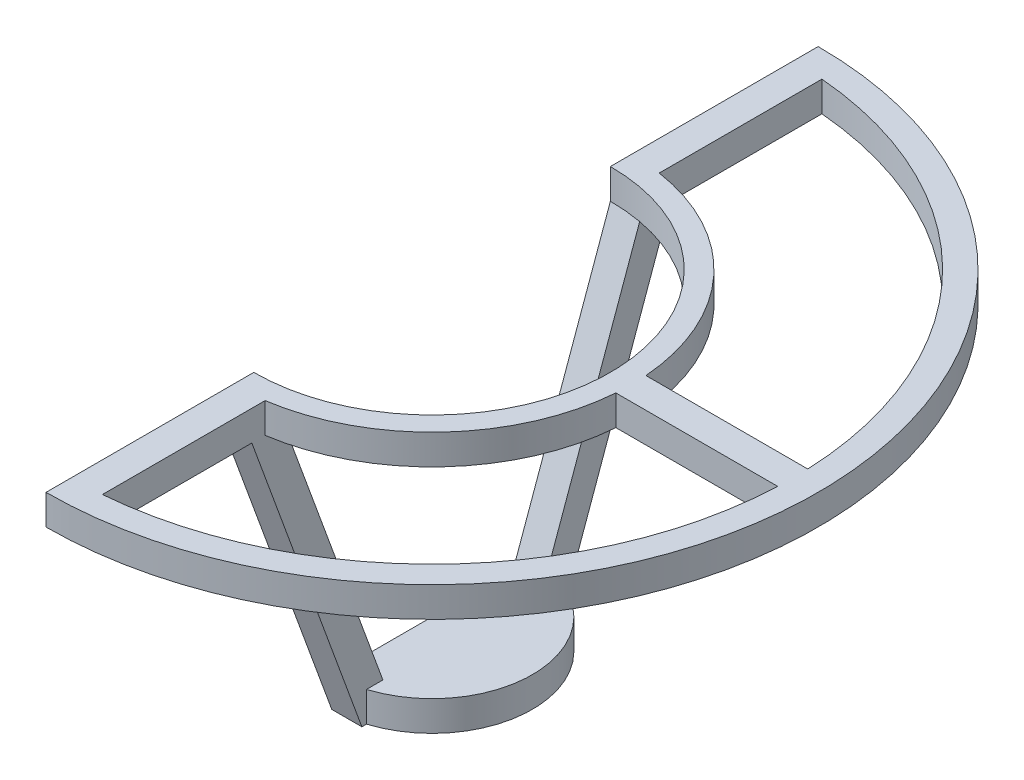
ISO-10303-21;
HEADER;
FILE_DESCRIPTION(('STEP AP214'),'2;1');
FILE_NAME('part.step','',(''),(''),'','','');
FILE_SCHEMA(('AUTOMOTIVE_DESIGN { 1 0 10303 214 1 1 1 1 }'));
ENDSEC;
DATA;
#1=APPLICATION_CONTEXT('core data for automotive mechanical design processes');
#2=APPLICATION_PROTOCOL_DEFINITION('international standard','automotive_design',2000,#1);
#3=PRODUCT_CONTEXT('',#1,'mechanical');
#4=PRODUCT('Part','Part','',(#3));
#5=PRODUCT_RELATED_PRODUCT_CATEGORY('part','',(#4));
#6=PRODUCT_DEFINITION_FORMATION('','',#4);
#7=PRODUCT_DEFINITION_CONTEXT('part definition',#1,'design');
#8=PRODUCT_DEFINITION('design','',#6,#7);
#9=PRODUCT_DEFINITION_SHAPE('','',#8);
#10=(LENGTH_UNIT() NAMED_UNIT(*) SI_UNIT(.MILLI.,.METRE.));
#11=(NAMED_UNIT(*) PLANE_ANGLE_UNIT() SI_UNIT($,.RADIAN.));
#12=(NAMED_UNIT(*) SI_UNIT($,.STERADIAN.) SOLID_ANGLE_UNIT());
#13=UNCERTAINTY_MEASURE_WITH_UNIT(LENGTH_MEASURE(1.E-05),#10,'distance_accuracy_value','');
#14=(GEOMETRIC_REPRESENTATION_CONTEXT(3) GLOBAL_UNCERTAINTY_ASSIGNED_CONTEXT((#13)) GLOBAL_UNIT_ASSIGNED_CONTEXT((#10,
#11,#12)) REPRESENTATION_CONTEXT('',''));
#15=CARTESIAN_POINT('',(0.,0.,0.));
#16=DIRECTION('',(0.,0.,1.));
#17=DIRECTION('',(1.,0.,0.));
#18=AXIS2_PLACEMENT_3D('',#15,#16,#17);
#19=CARTESIAN_POINT('',(0.,0.,0.));
#20=DIRECTION('',(0.,1.,0.));
#21=DIRECTION('',(0.,0.,1.));
#22=AXIS2_PLACEMENT_3D('',#19,#20,#21);
#23=PLANE('',#22);
#24=DIRECTION('',(-1.,0.,0.));
#25=VECTOR('',#24,1.);
#26=CARTESIAN_POINT('',(3.,0.,20.9744296941907));
#27=LINE('',#26,#25);
#28=CARTESIAN_POINT('',(3.,0.,20.9744296941907));
#29=VERTEX_POINT('',#28);
#30=CARTESIAN_POINT('',(0.,0.,20.9744296941907));
#31=VERTEX_POINT('',#30);
#32=EDGE_CURVE('E187',#29,#31,#27,.T.);
#33=ORIENTED_EDGE('',*,*,#32,.F.);
#34=DIRECTION('',(0.,0.,1.));
#35=VECTOR('',#34,1.);
#36=CARTESIAN_POINT('',(3.00000000000001,0.,19.652338283268));
#37=LINE('',#36,#35);
#38=CARTESIAN_POINT('',(3.00000000000001,0.,35.8747822293042));
#39=VERTEX_POINT('',#38);
#40=EDGE_CURVE('E241',#29,#39,#37,.T.);
#41=ORIENTED_EDGE('',*,*,#40,.T.);
#42=CARTESIAN_POINT('',(0.,0.,0.));
#43=DIRECTION('',(0.,1.,0.));
#44=DIRECTION('',(0.,0.,-1.));
#45=AXIS2_PLACEMENT_3D('',#42,#43,#44);
#46=CIRCLE('',#45,36.);
#47=CARTESIAN_POINT('',(35.9687364248454,0.,1.5));
#48=VERTEX_POINT('',#47);
#49=EDGE_CURVE('E243',#39,#48,#46,.T.);
#50=ORIENTED_EDGE('',*,*,#49,.T.);
#51=DIRECTION('',(-1.,0.,0.));
#52=VECTOR('',#51,1.);
#53=CARTESIAN_POINT('',(19.8233296900395,0.,1.5));
#54=LINE('',#53,#52);
#55=CARTESIAN_POINT('',(19.8233296900395,0.,1.5));
#56=VERTEX_POINT('',#55);
#57=EDGE_CURVE('E232',#48,#56,#54,.T.);
#58=ORIENTED_EDGE('',*,*,#57,.T.);
#59=CARTESIAN_POINT('',(0.,0.,0.));
#60=DIRECTION('',(0.,-1.,0.));
#61=DIRECTION('',(0.,0.,-1.));
#62=AXIS2_PLACEMENT_3D('',#59,#60,#61);
#63=CIRCLE('',#62,19.88);
#64=CARTESIAN_POINT('',(3.00000000000001,0.,19.652338283268));
#65=VERTEX_POINT('',#64);
#66=EDGE_CURVE('E228',#56,#65,#63,.T.);
#67=ORIENTED_EDGE('',*,*,#66,.T.);
#68=DIRECTION('',(0.,0.,1.));
#69=VECTOR('',#68,1.);
#70=CARTESIAN_POINT('',(3.,0.,17.78));
#71=LINE('',#70,#69);
#72=CARTESIAN_POINT('',(3.,0.,17.78));
#73=VERTEX_POINT('',#72);
#74=EDGE_CURVE('E52',#73,#65,#71,.T.);
#75=ORIENTED_EDGE('',*,*,#74,.F.);
#76=DIRECTION('',(-1.,0.,0.));
#77=VECTOR('',#76,1.);
#78=CARTESIAN_POINT('',(3.,0.,17.78));
#79=LINE('',#78,#77);
#80=CARTESIAN_POINT('',(0.,0.,17.78));
#81=VERTEX_POINT('',#80);
#82=EDGE_CURVE('E385',#73,#81,#79,.T.);
#83=ORIENTED_EDGE('',*,*,#82,.T.);
#84=CARTESIAN_POINT('',(0.,0.,0.));
#85=DIRECTION('',(0.,-1.,0.));
#86=DIRECTION('',(0.,0.,1.));
#87=AXIS2_PLACEMENT_3D('',#84,#85,#86);
#88=CIRCLE('',#87,17.78);
#89=CARTESIAN_POINT('',(0.,0.,-17.78));
#90=VERTEX_POINT('',#89);
#91=EDGE_CURVE('E303',#90,#81,#88,.T.);
#92=ORIENTED_EDGE('',*,*,#91,.F.);
#93=DIRECTION('',(-1.,0.,0.));
#94=VECTOR('',#93,1.);
#95=CARTESIAN_POINT('',(3.,0.,-17.78));
#96=LINE('',#95,#94);
#97=CARTESIAN_POINT('',(3.,0.,-17.78));
#98=VERTEX_POINT('',#97);
#99=EDGE_CURVE('E225',#98,#90,#96,.T.);
#100=ORIENTED_EDGE('',*,*,#99,.F.);
#101=DIRECTION('',(0.,0.,1.));
#102=VECTOR('',#101,1.);
#103=CARTESIAN_POINT('',(3.,0.,-20.78));
#104=LINE('',#103,#102);
#105=CARTESIAN_POINT('',(3.,0.,-19.652338283268));
#106=VERTEX_POINT('',#105);
#107=EDGE_CURVE('E45',#106,#98,#104,.T.);
#108=ORIENTED_EDGE('',*,*,#107,.F.);
#109=CARTESIAN_POINT('',(0.,0.,0.));
#110=DIRECTION('',(0.,-1.,0.));
#111=DIRECTION('',(0.,0.,-1.));
#112=AXIS2_PLACEMENT_3D('',#109,#110,#111);
#113=CIRCLE('',#112,19.88);
#114=CARTESIAN_POINT('',(19.8233296900395,0.,-1.5));
#115=VERTEX_POINT('',#114);
#116=EDGE_CURVE('E257',#106,#115,#113,.T.);
#117=ORIENTED_EDGE('',*,*,#116,.T.);
#118=DIRECTION('',(1.,0.,0.));
#119=VECTOR('',#118,1.);
#120=CARTESIAN_POINT('',(19.8233296900395,0.,-1.5));
#121=LINE('',#120,#119);
#122=CARTESIAN_POINT('',(35.9687364248454,0.,-1.5));
#123=VERTEX_POINT('',#122);
#124=EDGE_CURVE('E271',#115,#123,#121,.T.);
#125=ORIENTED_EDGE('',*,*,#124,.T.);
#126=CARTESIAN_POINT('',(0.,0.,0.));
#127=DIRECTION('',(0.,1.,0.));
#128=DIRECTION('',(0.,0.,-1.));
#129=AXIS2_PLACEMENT_3D('',#126,#127,#128);
#130=CIRCLE('',#129,36.);
#131=CARTESIAN_POINT('',(3.00000000000001,0.,-35.8747822293042));
#132=VERTEX_POINT('',#131);
#133=EDGE_CURVE('E274',#123,#132,#130,.T.);
#134=ORIENTED_EDGE('',*,*,#133,.T.);
#135=DIRECTION('',(0.,0.,1.));
#136=VECTOR('',#135,1.);
#137=CARTESIAN_POINT('',(3.00000000000001,0.,-35.8747822293042));
#138=LINE('',#137,#136);
#139=CARTESIAN_POINT('',(3.,0.,-20.78));
#140=VERTEX_POINT('',#139);
#141=EDGE_CURVE('E261',#132,#140,#138,.T.);
#142=ORIENTED_EDGE('',*,*,#141,.T.);
#143=DIRECTION('',(-1.,0.,0.));
#144=VECTOR('',#143,1.);
#145=CARTESIAN_POINT('',(3.,0.,-20.78));
#146=LINE('',#145,#144);
#147=CARTESIAN_POINT('',(0.,0.,-20.78));
#148=VERTEX_POINT('',#147);
#149=EDGE_CURVE('E216',#140,#148,#146,.T.);
#150=ORIENTED_EDGE('',*,*,#149,.T.);
#151=DIRECTION('',(0.,0.,1.));
#152=VECTOR('',#151,1.);
#153=CARTESIAN_POINT('',(0.,0.,-17.78));
#154=LINE('',#153,#152);
#155=CARTESIAN_POINT('',(0.,0.,-38.5));
#156=VERTEX_POINT('',#155);
#157=EDGE_CURVE('E301',#156,#148,#154,.T.);
#158=ORIENTED_EDGE('',*,*,#157,.F.);
#159=CARTESIAN_POINT('',(0.,0.,0.));
#160=DIRECTION('',(0.,1.,0.));
#161=DIRECTION('',(0.,0.,1.));
#162=AXIS2_PLACEMENT_3D('',#159,#160,#161);
#163=CIRCLE('',#162,38.5);
#164=CARTESIAN_POINT('',(0.,0.,38.5));
#165=VERTEX_POINT('',#164);
#166=EDGE_CURVE('E288',#165,#156,#163,.T.);
#167=ORIENTED_EDGE('',*,*,#166,.F.);
#168=DIRECTION('',(0.,0.,1.));
#169=VECTOR('',#168,1.);
#170=CARTESIAN_POINT('',(0.,0.,17.78));
#171=LINE('',#170,#169);
#172=EDGE_CURVE('E59',#31,#165,#171,.T.);
#173=ORIENTED_EDGE('',*,*,#172,.F.);
#174=EDGE_LOOP('',(#33,#41,#50,#58,#67,#75,#83,#92,#100,#108,#117,#125,#134,#142,#150,#158,#167,#173));
#175=FACE_BOUND('',#174,.T.);
#176=ADVANCED_FACE('F37',(#175),#23,.F.);
#177=CARTESIAN_POINT('',(0.,-27.,0.));
#178=DIRECTION('',(0.,-1.,0.));
#179=DIRECTION('',(0.,0.,-1.));
#180=AXIS2_PLACEMENT_3D('',#177,#178,#179);
#181=PLANE('',#180);
#182=DIRECTION('',(-1.,0.,0.));
#183=VECTOR('',#182,1.);
#184=CARTESIAN_POINT('',(3.,-27.,7.90301327522836));
#185=LINE('',#184,#183);
#186=CARTESIAN_POINT('',(3.,-27.,7.90301327522836));
#187=VERTEX_POINT('',#186);
#188=CARTESIAN_POINT('',(0.,-27.,7.90301327522836));
#189=VERTEX_POINT('',#188);
#190=EDGE_CURVE('E200',#187,#189,#185,.T.);
#191=ORIENTED_EDGE('',*,*,#190,.F.);
#192=DIRECTION('',(0.,0.,1.));
#193=VECTOR('',#192,1.);
#194=CARTESIAN_POINT('',(3.,-27.,0.));
#195=LINE('',#194,#193);
#196=CARTESIAN_POINT('',(3.,-27.,9.53939201416946));
#197=VERTEX_POINT('',#196);
#198=EDGE_CURVE('E11',#187,#197,#195,.T.);
#199=ORIENTED_EDGE('',*,*,#198,.T.);
#200=CARTESIAN_POINT('',(0.,-27.,0.));
#201=DIRECTION('',(0.,-1.,0.));
#202=DIRECTION('',(0.,0.,-1.));
#203=AXIS2_PLACEMENT_3D('',#200,#201,#202);
#204=CIRCLE('',#203,10.);
#205=CARTESIAN_POINT('',(3.00000000000001,-27.,-9.53939201416945));
#206=VERTEX_POINT('',#205);
#207=EDGE_CURVE('E368',#206,#197,#204,.T.);
#208=ORIENTED_EDGE('',*,*,#207,.F.);
#209=DIRECTION('',(0.,0.,-1.));
#210=VECTOR('',#209,1.);
#211=CARTESIAN_POINT('',(3.00000000000001,-27.,-35.8747822293042));
#212=LINE('',#211,#210);
#213=CARTESIAN_POINT('',(3.,-27.,-8.078));
#214=VERTEX_POINT('',#213);
#215=EDGE_CURVE('E212',#214,#206,#212,.T.);
#216=ORIENTED_EDGE('',*,*,#215,.F.);
#217=DIRECTION('',(-1.,0.,0.));
#218=VECTOR('',#217,1.);
#219=CARTESIAN_POINT('',(3.,-27.,-8.078));
#220=LINE('',#219,#218);
#221=CARTESIAN_POINT('',(0.,-27.,-8.078));
#222=VERTEX_POINT('',#221);
#223=EDGE_CURVE('E222',#214,#222,#220,.T.);
#224=ORIENTED_EDGE('',*,*,#223,.T.);
#225=DIRECTION('',(0.,0.,-1.));
#226=VECTOR('',#225,1.);
#227=CARTESIAN_POINT('',(0.,-27.,-10.));
#228=LINE('',#227,#226);
#229=EDGE_CURVE('E362',#189,#222,#228,.T.);
#230=ORIENTED_EDGE('',*,*,#229,.F.);
#231=EDGE_LOOP('',(#191,#199,#208,#216,#224,#230));
#232=FACE_BOUND('',#231,.T.);
#233=ADVANCED_FACE('F370',(#232),#181,.F.);
#234=CARTESIAN_POINT('',(0.,3.,0.));
#235=DIRECTION('',(0.,1.,0.));
#236=DIRECTION('',(0.,0.,1.));
#237=AXIS2_PLACEMENT_3D('',#234,#235,#236);
#238=PLANE('',#237);
#239=CARTESIAN_POINT('',(0.,3.,0.));
#240=DIRECTION('',(0.,1.,0.));
#241=DIRECTION('',(0.,0.,1.));
#242=AXIS2_PLACEMENT_3D('',#239,#240,#241);
#243=CIRCLE('',#242,38.5);
#244=CARTESIAN_POINT('',(0.,3.,38.5));
#245=VERTEX_POINT('',#244);
#246=CARTESIAN_POINT('',(0.,3.,-38.5));
#247=VERTEX_POINT('',#246);
#248=EDGE_CURVE('E289',#245,#247,#243,.T.);
#249=ORIENTED_EDGE('',*,*,#248,.T.);
#250=DIRECTION('',(0.,0.,1.));
#251=VECTOR('',#250,1.);
#252=CARTESIAN_POINT('',(0.,3.,-17.78));
#253=LINE('',#252,#251);
#254=CARTESIAN_POINT('',(0.,3.,-17.78));
#255=VERTEX_POINT('',#254);
#256=EDGE_CURVE('E292',#247,#255,#253,.T.);
#257=ORIENTED_EDGE('',*,*,#256,.T.);
#258=CARTESIAN_POINT('',(0.,3.,0.));
#259=DIRECTION('',(0.,-1.,0.));
#260=DIRECTION('',(0.,0.,1.));
#261=AXIS2_PLACEMENT_3D('',#258,#259,#260);
#262=CIRCLE('',#261,17.78);
#263=CARTESIAN_POINT('',(0.,3.,17.78));
#264=VERTEX_POINT('',#263);
#265=EDGE_CURVE('E294',#255,#264,#262,.T.);
#266=ORIENTED_EDGE('',*,*,#265,.T.);
#267=DIRECTION('',(0.,0.,1.));
#268=VECTOR('',#267,1.);
#269=CARTESIAN_POINT('',(0.,3.,17.78));
#270=LINE('',#269,#268);
#271=EDGE_CURVE('E296',#264,#245,#270,.T.);
#272=ORIENTED_EDGE('',*,*,#271,.T.);
#273=EDGE_LOOP('',(#249,#257,#266,#272));
#274=FACE_BOUND('',#273,.T.);
#275=DIRECTION('',(1.,0.,0.));
#276=VECTOR('',#275,1.);
#277=CARTESIAN_POINT('',(19.8233296900395,3.,-1.5));
#278=LINE('',#277,#276);
#279=CARTESIAN_POINT('',(19.8233296900395,3.,-1.5));
#280=VERTEX_POINT('',#279);
#281=CARTESIAN_POINT('',(35.9687364248454,3.,-1.5));
#282=VERTEX_POINT('',#281);
#283=EDGE_CURVE('E260',#280,#282,#278,.T.);
#284=ORIENTED_EDGE('',*,*,#283,.F.);
#285=CARTESIAN_POINT('',(0.,3.,0.));
#286=DIRECTION('',(0.,-1.,0.));
#287=DIRECTION('',(0.,0.,-1.));
#288=AXIS2_PLACEMENT_3D('',#285,#286,#287);
#289=CIRCLE('',#288,19.88);
#290=CARTESIAN_POINT('',(3.00000000000001,3.,-19.652338283268));
#291=VERTEX_POINT('',#290);
#292=EDGE_CURVE('E258',#291,#280,#289,.T.);
#293=ORIENTED_EDGE('',*,*,#292,.F.);
#294=DIRECTION('',(0.,0.,1.));
#295=VECTOR('',#294,1.);
#296=CARTESIAN_POINT('',(3.00000000000001,3.,-35.8747822293042));
#297=LINE('',#296,#295);
#298=CARTESIAN_POINT('',(3.00000000000001,3.,-35.8747822293042));
#299=VERTEX_POINT('',#298);
#300=EDGE_CURVE('E266',#299,#291,#297,.T.);
#301=ORIENTED_EDGE('',*,*,#300,.F.);
#302=CARTESIAN_POINT('',(0.,3.,0.));
#303=DIRECTION('',(0.,1.,0.));
#304=DIRECTION('',(0.,0.,-1.));
#305=AXIS2_PLACEMENT_3D('',#302,#303,#304);
#306=CIRCLE('',#305,36.);
#307=EDGE_CURVE('E263',#282,#299,#306,.T.);
#308=ORIENTED_EDGE('',*,*,#307,.F.);
#309=EDGE_LOOP('',(#284,#293,#301,#308));
#310=FACE_BOUND('',#309,.T.);
#311=DIRECTION('',(0.,0.,1.));
#312=VECTOR('',#311,1.);
#313=CARTESIAN_POINT('',(3.00000000000001,3.,19.652338283268));
#314=LINE('',#313,#312);
#315=CARTESIAN_POINT('',(3.00000000000001,3.,19.652338283268));
#316=VERTEX_POINT('',#315);
#317=CARTESIAN_POINT('',(3.00000000000001,3.,35.8747822293042));
#318=VERTEX_POINT('',#317);
#319=EDGE_CURVE('E231',#316,#318,#314,.T.);
#320=ORIENTED_EDGE('',*,*,#319,.F.);
#321=CARTESIAN_POINT('',(0.,3.,0.));
#322=DIRECTION('',(0.,-1.,0.));
#323=DIRECTION('',(0.,0.,-1.));
#324=AXIS2_PLACEMENT_3D('',#321,#322,#323);
#325=CIRCLE('',#324,19.88);
#326=CARTESIAN_POINT('',(19.8233296900395,3.,1.5));
#327=VERTEX_POINT('',#326);
#328=EDGE_CURVE('E229',#327,#316,#325,.T.);
#329=ORIENTED_EDGE('',*,*,#328,.F.);
#330=DIRECTION('',(-1.,0.,0.));
#331=VECTOR('',#330,1.);
#332=CARTESIAN_POINT('',(19.8233296900395,3.,1.5));
#333=LINE('',#332,#331);
#334=CARTESIAN_POINT('',(35.9687364248454,3.,1.5));
#335=VERTEX_POINT('',#334);
#336=EDGE_CURVE('E237',#335,#327,#333,.T.);
#337=ORIENTED_EDGE('',*,*,#336,.F.);
#338=CARTESIAN_POINT('',(0.,3.,0.));
#339=DIRECTION('',(0.,1.,0.));
#340=DIRECTION('',(0.,0.,-1.));
#341=AXIS2_PLACEMENT_3D('',#338,#339,#340);
#342=CIRCLE('',#341,36.);
#343=EDGE_CURVE('E234',#318,#335,#342,.T.);
#344=ORIENTED_EDGE('',*,*,#343,.F.);
#345=EDGE_LOOP('',(#320,#329,#337,#344));
#346=FACE_BOUND('',#345,.T.);
#347=ADVANCED_FACE('F347',(#274,#310,#346),#238,.T.);
#348=CARTESIAN_POINT('',(0.,3.,0.));
#349=DIRECTION('',(0.,-1.,0.));
#350=DIRECTION('',(0.,0.,-1.));
#351=AXIS2_PLACEMENT_3D('',#348,#349,#350);
#352=CYLINDRICAL_SURFACE('',#351,38.5);
#353=ORIENTED_EDGE('',*,*,#166,.T.);
#354=DIRECTION('',(0.,-1.,0.));
#355=VECTOR('',#354,1.);
#356=CARTESIAN_POINT('',(0.,3.,-38.5));
#357=LINE('',#356,#355);
#358=EDGE_CURVE('E313',#247,#156,#357,.T.);
#359=ORIENTED_EDGE('',*,*,#358,.F.);
#360=ORIENTED_EDGE('',*,*,#248,.F.);
#361=DIRECTION('',(0.,-1.,0.));
#362=VECTOR('',#361,1.);
#363=CARTESIAN_POINT('',(0.,3.,38.5));
#364=LINE('',#363,#362);
#365=EDGE_CURVE('E298',#245,#165,#364,.T.);
#366=ORIENTED_EDGE('',*,*,#365,.T.);
#367=EDGE_LOOP('',(#353,#359,#360,#366));
#368=FACE_BOUND('',#367,.T.);
#369=ADVANCED_FACE('F39',(#368),#352,.T.);
#370=CARTESIAN_POINT('',(0.,3.,0.));
#371=DIRECTION('',(0.,-1.,0.));
#372=DIRECTION('',(0.,0.,-1.));
#373=AXIS2_PLACEMENT_3D('',#370,#371,#372);
#374=CYLINDRICAL_SURFACE('',#373,17.78);
#375=ORIENTED_EDGE('',*,*,#91,.T.);
#376=DIRECTION('',(0.,-1.,0.));
#377=VECTOR('',#376,1.);
#378=CARTESIAN_POINT('',(0.,3.,17.78));
#379=LINE('',#378,#377);
#380=EDGE_CURVE('E309',#264,#81,#379,.T.);
#381=ORIENTED_EDGE('',*,*,#380,.F.);
#382=ORIENTED_EDGE('',*,*,#265,.F.);
#383=DIRECTION('',(0.,-1.,0.));
#384=VECTOR('',#383,1.);
#385=CARTESIAN_POINT('',(0.,3.,-17.78));
#386=LINE('',#385,#384);
#387=EDGE_CURVE('E311',#255,#90,#386,.T.);
#388=ORIENTED_EDGE('',*,*,#387,.T.);
#389=EDGE_LOOP('',(#375,#381,#382,#388));
#390=FACE_BOUND('',#389,.T.);
#391=ADVANCED_FACE('F359',(#390),#374,.F.);
#392=CARTESIAN_POINT('',(0.,3.,17.78));
#393=DIRECTION('',(1.,0.,0.));
#394=DIRECTION('',(0.,0.,-1.));
#395=AXIS2_PLACEMENT_3D('',#392,#393,#394);
#396=PLANE('',#395);
#397=ORIENTED_EDGE('',*,*,#380,.T.);
#398=DIRECTION('',(0.,0.93913477120993,0.343548950667109));
#399=VECTOR('',#398,1.);
#400=CARTESIAN_POINT('',(0.,0.,17.78));
#401=LINE('',#400,#399);
#402=EDGE_CURVE('E191',#189,#81,#401,.T.);
#403=ORIENTED_EDGE('',*,*,#402,.F.);
#404=ORIENTED_EDGE('',*,*,#229,.T.);
#405=DIRECTION('',(0.,-0.941087195642508,0.338163998967541));
#406=VECTOR('',#405,1.);
#407=CARTESIAN_POINT('',(0.,0.,-17.78));
#408=LINE('',#407,#406);
#409=EDGE_CURVE('E207',#90,#222,#408,.T.);
#410=ORIENTED_EDGE('',*,*,#409,.F.);
#411=ORIENTED_EDGE('',*,*,#387,.F.);
#412=ORIENTED_EDGE('',*,*,#256,.F.);
#413=ORIENTED_EDGE('',*,*,#358,.T.);
#414=ORIENTED_EDGE('',*,*,#157,.T.);
#415=DIRECTION('',(0.,0.941087195642508,-0.338163998967541));
#416=VECTOR('',#415,1.);
#417=CARTESIAN_POINT('',(0.,0.,-20.78));
#418=LINE('',#417,#416);
#419=CARTESIAN_POINT('',(0.,-30.,-10.));
#420=VERTEX_POINT('',#419);
#421=EDGE_CURVE('E206',#420,#148,#418,.T.);
#422=ORIENTED_EDGE('',*,*,#421,.F.);
#423=DIRECTION('',(0.,0.,-1.));
#424=VECTOR('',#423,1.);
#425=CARTESIAN_POINT('',(0.,-30.,-8.078));
#426=LINE('',#425,#424);
#427=CARTESIAN_POINT('',(0.,-30.,10.));
#428=VERTEX_POINT('',#427);
#429=EDGE_CURVE('E196',#428,#420,#426,.T.);
#430=ORIENTED_EDGE('',*,*,#429,.F.);
#431=DIRECTION('',(0.,-0.93913477120993,-0.343548950667109));
#432=VECTOR('',#431,1.);
#433=CARTESIAN_POINT('',(0.,0.,20.9744296941907));
#434=LINE('',#433,#432);
#435=EDGE_CURVE('E181',#31,#428,#434,.T.);
#436=ORIENTED_EDGE('',*,*,#435,.F.);
#437=ORIENTED_EDGE('',*,*,#172,.T.);
#438=ORIENTED_EDGE('',*,*,#365,.F.);
#439=ORIENTED_EDGE('',*,*,#271,.F.);
#440=EDGE_LOOP('',(#397,#403,#404,#410,#411,#412,#413,#414,#422,#430,#436,#437,#438,#439));
#441=FACE_BOUND('',#440,.T.);
#442=ADVANCED_FACE('F204',(#441),#396,.F.);
#443=CARTESIAN_POINT('',(0.,3.,0.));
#444=DIRECTION('',(0.,-1.,0.));
#445=DIRECTION('',(0.,0.,-1.));
#446=AXIS2_PLACEMENT_3D('',#443,#444,#445);
#447=CYLINDRICAL_SURFACE('',#446,19.88);
#448=ORIENTED_EDGE('',*,*,#116,.F.);
#449=DIRECTION('',(0.,-1.,0.));
#450=VECTOR('',#449,1.);
#451=CARTESIAN_POINT('',(3.00000000000001,3.,-19.652338283268));
#452=LINE('',#451,#450);
#453=EDGE_CURVE('E268',#291,#106,#452,.T.);
#454=ORIENTED_EDGE('',*,*,#453,.F.);
#455=ORIENTED_EDGE('',*,*,#292,.T.);
#456=DIRECTION('',(0.,-1.,0.));
#457=VECTOR('',#456,1.);
#458=CARTESIAN_POINT('',(19.8233296900395,3.,-1.5));
#459=LINE('',#458,#457);
#460=EDGE_CURVE('E285',#280,#115,#459,.T.);
#461=ORIENTED_EDGE('',*,*,#460,.T.);
#462=EDGE_LOOP('',(#448,#454,#455,#461));
#463=FACE_BOUND('',#462,.T.);
#464=ADVANCED_FACE('F344',(#463),#447,.T.);
#465=CARTESIAN_POINT('',(19.8233296900395,3.,-1.5));
#466=DIRECTION('',(0.,0.,-1.));
#467=DIRECTION('',(-1.,0.,0.));
#468=AXIS2_PLACEMENT_3D('',#465,#466,#467);
#469=PLANE('',#468);
#470=ORIENTED_EDGE('',*,*,#124,.F.);
#471=ORIENTED_EDGE('',*,*,#460,.F.);
#472=ORIENTED_EDGE('',*,*,#283,.T.);
#473=DIRECTION('',(0.,-1.,0.));
#474=VECTOR('',#473,1.);
#475=CARTESIAN_POINT('',(35.9687364248454,3.,-1.5));
#476=LINE('',#475,#474);
#477=EDGE_CURVE('E283',#282,#123,#476,.T.);
#478=ORIENTED_EDGE('',*,*,#477,.T.);
#479=EDGE_LOOP('',(#470,#471,#472,#478));
#480=FACE_BOUND('',#479,.T.);
#481=ADVANCED_FACE('F350',(#480),#469,.T.);
#482=CARTESIAN_POINT('',(0.,3.,0.));
#483=DIRECTION('',(0.,-1.,0.));
#484=DIRECTION('',(0.,0.,-1.));
#485=AXIS2_PLACEMENT_3D('',#482,#483,#484);
#486=CYLINDRICAL_SURFACE('',#485,36.);
#487=ORIENTED_EDGE('',*,*,#133,.F.);
#488=ORIENTED_EDGE('',*,*,#477,.F.);
#489=ORIENTED_EDGE('',*,*,#307,.T.);
#490=DIRECTION('',(0.,-1.,0.));
#491=VECTOR('',#490,1.);
#492=CARTESIAN_POINT('',(3.00000000000001,3.,-35.8747822293042));
#493=LINE('',#492,#491);
#494=EDGE_CURVE('E281',#299,#132,#493,.T.);
#495=ORIENTED_EDGE('',*,*,#494,.T.);
#496=EDGE_LOOP('',(#487,#488,#489,#495));
#497=FACE_BOUND('',#496,.T.);
#498=ADVANCED_FACE('F336',(#497),#486,.F.);
#499=CARTESIAN_POINT('',(3.00000000000001,3.,-35.8747822293042));
#500=DIRECTION('',(1.,0.,0.));
#501=DIRECTION('',(0.,0.,-1.));
#502=AXIS2_PLACEMENT_3D('',#499,#500,#501);
#503=PLANE('',#502);
#504=DIRECTION('',(0.,-1.,0.));
#505=VECTOR('',#504,1.);
#506=CARTESIAN_POINT('',(3.00000000000001,-27.,-9.53939201416945));
#507=LINE('',#506,#505);
#508=CARTESIAN_POINT('',(3.,-30.,-9.53939201416946));
#509=VERTEX_POINT('',#508);
#510=EDGE_CURVE('E367',#509,#206,#507,.F.);
#511=ORIENTED_EDGE('',*,*,#510,.F.);
#512=DIRECTION('',(0.,0.,-1.));
#513=VECTOR('',#512,1.);
#514=CARTESIAN_POINT('',(3.,-30.,-8.078));
#515=LINE('',#514,#513);
#516=CARTESIAN_POINT('',(3.,-30.,-10.));
#517=VERTEX_POINT('',#516);
#518=EDGE_CURVE('E324',#509,#517,#515,.T.);
#519=ORIENTED_EDGE('',*,*,#518,.T.);
#520=DIRECTION('',(0.,0.941087195642508,-0.338163998967541));
#521=VECTOR('',#520,1.);
#522=CARTESIAN_POINT('',(3.,0.,-20.78));
#523=LINE('',#522,#521);
#524=EDGE_CURVE('E220',#517,#140,#523,.T.);
#525=ORIENTED_EDGE('',*,*,#524,.T.);
#526=ORIENTED_EDGE('',*,*,#141,.F.);
#527=ORIENTED_EDGE('',*,*,#494,.F.);
#528=ORIENTED_EDGE('',*,*,#300,.T.);
#529=ORIENTED_EDGE('',*,*,#453,.T.);
#530=ORIENTED_EDGE('',*,*,#107,.T.);
#531=DIRECTION('',(0.,-0.941087195642508,0.338163998967541));
#532=VECTOR('',#531,1.);
#533=CARTESIAN_POINT('',(3.,0.,-17.78));
#534=LINE('',#533,#532);
#535=EDGE_CURVE('E209',#98,#214,#534,.T.);
#536=ORIENTED_EDGE('',*,*,#535,.T.);
#537=ORIENTED_EDGE('',*,*,#215,.T.);
#538=EDGE_LOOP('',(#511,#519,#525,#526,#527,#528,#529,#530,#536,#537));
#539=FACE_BOUND('',#538,.T.);
#540=ADVANCED_FACE('F329',(#539),#503,.T.);
#541=CARTESIAN_POINT('',(0.,3.,0.));
#542=DIRECTION('',(0.,-1.,0.));
#543=DIRECTION('',(0.,0.,-1.));
#544=AXIS2_PLACEMENT_3D('',#541,#542,#543);
#545=CYLINDRICAL_SURFACE('',#544,19.88);
#546=ORIENTED_EDGE('',*,*,#66,.F.);
#547=DIRECTION('',(0.,-1.,0.));
#548=VECTOR('',#547,1.);
#549=CARTESIAN_POINT('',(19.8233296900395,3.,1.5));
#550=LINE('',#549,#548);
#551=EDGE_CURVE('E239',#327,#56,#550,.T.);
#552=ORIENTED_EDGE('',*,*,#551,.F.);
#553=ORIENTED_EDGE('',*,*,#328,.T.);
#554=DIRECTION('',(0.,-1.,0.));
#555=VECTOR('',#554,1.);
#556=CARTESIAN_POINT('',(3.00000000000001,3.,19.652338283268));
#557=LINE('',#556,#555);
#558=EDGE_CURVE('E255',#316,#65,#557,.T.);
#559=ORIENTED_EDGE('',*,*,#558,.T.);
#560=EDGE_LOOP('',(#546,#552,#553,#559));
#561=FACE_BOUND('',#560,.T.);
#562=ADVANCED_FACE('F410',(#561),#545,.T.);
#563=CARTESIAN_POINT('',(3.00000000000001,3.,19.652338283268));
#564=DIRECTION('',(1.,0.,0.));
#565=DIRECTION('',(0.,0.,-1.));
#566=AXIS2_PLACEMENT_3D('',#563,#564,#565);
#567=PLANE('',#566);
#568=ORIENTED_EDGE('',*,*,#40,.F.);
#569=DIRECTION('',(0.,-0.93913477120993,-0.343548950667109));
#570=VECTOR('',#569,1.);
#571=CARTESIAN_POINT('',(3.,0.,20.9744296941907));
#572=LINE('',#571,#570);
#573=CARTESIAN_POINT('',(3.,-30.,10.));
#574=VERTEX_POINT('',#573);
#575=EDGE_CURVE('E381',#29,#574,#572,.T.);
#576=ORIENTED_EDGE('',*,*,#575,.T.);
#577=DIRECTION('',(0.,0.,-1.));
#578=VECTOR('',#577,1.);
#579=CARTESIAN_POINT('',(3.,-30.,7.90301327522836));
#580=LINE('',#579,#578);
#581=CARTESIAN_POINT('',(3.,-30.,9.53939201416946));
#582=VERTEX_POINT('',#581);
#583=EDGE_CURVE('E199',#574,#582,#580,.T.);
#584=ORIENTED_EDGE('',*,*,#583,.T.);
#585=DIRECTION('',(0.,-1.,0.));
#586=VECTOR('',#585,1.);
#587=CARTESIAN_POINT('',(3.,-27.,9.53939201416946));
#588=LINE('',#587,#586);
#589=EDGE_CURVE('E190',#582,#197,#588,.F.);
#590=ORIENTED_EDGE('',*,*,#589,.T.);
#591=ORIENTED_EDGE('',*,*,#198,.F.);
#592=DIRECTION('',(0.,0.93913477120993,0.343548950667109));
#593=VECTOR('',#592,1.);
#594=CARTESIAN_POINT('',(3.,0.,17.78));
#595=LINE('',#594,#593);
#596=EDGE_CURVE('E384',#187,#73,#595,.T.);
#597=ORIENTED_EDGE('',*,*,#596,.T.);
#598=ORIENTED_EDGE('',*,*,#74,.T.);
#599=ORIENTED_EDGE('',*,*,#558,.F.);
#600=ORIENTED_EDGE('',*,*,#319,.T.);
#601=DIRECTION('',(0.,-1.,0.));
#602=VECTOR('',#601,1.);
#603=CARTESIAN_POINT('',(3.00000000000001,3.,35.8747822293042));
#604=LINE('',#603,#602);
#605=EDGE_CURVE('E252',#318,#39,#604,.T.);
#606=ORIENTED_EDGE('',*,*,#605,.T.);
#607=EDGE_LOOP('',(#568,#576,#584,#590,#591,#597,#598,#599,#600,#606));
#608=FACE_BOUND('',#607,.T.);
#609=ADVANCED_FACE('F397',(#608),#567,.T.);
#610=CARTESIAN_POINT('',(0.,3.,0.));
#611=DIRECTION('',(0.,-1.,0.));
#612=DIRECTION('',(0.,0.,-1.));
#613=AXIS2_PLACEMENT_3D('',#610,#611,#612);
#614=CYLINDRICAL_SURFACE('',#613,36.);
#615=ORIENTED_EDGE('',*,*,#49,.F.);
#616=ORIENTED_EDGE('',*,*,#605,.F.);
#617=ORIENTED_EDGE('',*,*,#343,.T.);
#618=DIRECTION('',(0.,-1.,0.));
#619=VECTOR('',#618,1.);
#620=CARTESIAN_POINT('',(35.9687364248454,3.,1.5));
#621=LINE('',#620,#619);
#622=EDGE_CURVE('E250',#335,#48,#621,.T.);
#623=ORIENTED_EDGE('',*,*,#622,.T.);
#624=EDGE_LOOP('',(#615,#616,#617,#623));
#625=FACE_BOUND('',#624,.T.);
#626=ADVANCED_FACE('F402',(#625),#614,.F.);
#627=CARTESIAN_POINT('',(19.8233296900395,3.,1.5));
#628=DIRECTION('',(0.,0.,1.));
#629=DIRECTION('',(1.,0.,0.));
#630=AXIS2_PLACEMENT_3D('',#627,#628,#629);
#631=PLANE('',#630);
#632=ORIENTED_EDGE('',*,*,#57,.F.);
#633=ORIENTED_EDGE('',*,*,#622,.F.);
#634=ORIENTED_EDGE('',*,*,#336,.T.);
#635=ORIENTED_EDGE('',*,*,#551,.T.);
#636=EDGE_LOOP('',(#632,#633,#634,#635));
#637=FACE_BOUND('',#636,.T.);
#638=ADVANCED_FACE('F406',(#637),#631,.T.);
#639=CARTESIAN_POINT('',(3.,0.,-17.78));
#640=DIRECTION('',(0.,-0.338163998967541,-0.941087195642508));
#641=DIRECTION('',(0.,0.941087195642508,-0.338163998967541));
#642=AXIS2_PLACEMENT_3D('',#639,#640,#641);
#643=PLANE('',#642);
#644=ORIENTED_EDGE('',*,*,#409,.T.);
#645=ORIENTED_EDGE('',*,*,#223,.F.);
#646=ORIENTED_EDGE('',*,*,#535,.F.);
#647=ORIENTED_EDGE('',*,*,#99,.T.);
#648=EDGE_LOOP('',(#644,#645,#646,#647));
#649=FACE_BOUND('',#648,.T.);
#650=ADVANCED_FACE('F354',(#649),#643,.F.);
#651=CARTESIAN_POINT('',(3.,-30.,-8.078));
#652=DIRECTION('',(0.,1.,0.));
#653=DIRECTION('',(0.,0.,1.));
#654=AXIS2_PLACEMENT_3D('',#651,#652,#653);
#655=PLANE('',#654);
#656=ORIENTED_EDGE('',*,*,#429,.T.);
#657=DIRECTION('',(-1.,0.,0.));
#658=VECTOR('',#657,1.);
#659=CARTESIAN_POINT('',(3.,-30.,-10.));
#660=LINE('',#659,#658);
#661=EDGE_CURVE('E219',#517,#420,#660,.T.);
#662=ORIENTED_EDGE('',*,*,#661,.F.);
#663=ORIENTED_EDGE('',*,*,#518,.F.);
#664=CARTESIAN_POINT('',(0.,-30.,0.));
#665=DIRECTION('',(0.,-1.,0.));
#666=DIRECTION('',(0.,0.,-1.));
#667=AXIS2_PLACEMENT_3D('',#664,#665,#666);
#668=CIRCLE('',#667,10.);
#669=EDGE_CURVE('E376',#509,#582,#668,.T.);
#670=ORIENTED_EDGE('',*,*,#669,.T.);
#671=ORIENTED_EDGE('',*,*,#583,.F.);
#672=DIRECTION('',(-1.,0.,0.));
#673=VECTOR('',#672,1.);
#674=CARTESIAN_POINT('',(3.,-30.,10.));
#675=LINE('',#674,#673);
#676=EDGE_CURVE('E185',#574,#428,#675,.T.);
#677=ORIENTED_EDGE('',*,*,#676,.T.);
#678=EDGE_LOOP('',(#656,#662,#663,#670,#671,#677));
#679=FACE_BOUND('',#678,.T.);
#680=ADVANCED_FACE('F194',(#679),#655,.F.);
#681=CARTESIAN_POINT('',(3.,0.,-20.78));
#682=DIRECTION('',(0.,0.338163998967541,0.941087195642508));
#683=DIRECTION('',(0.,-0.941087195642508,0.338163998967541));
#684=AXIS2_PLACEMENT_3D('',#681,#682,#683);
#685=PLANE('',#684);
#686=ORIENTED_EDGE('',*,*,#421,.T.);
#687=ORIENTED_EDGE('',*,*,#149,.F.);
#688=ORIENTED_EDGE('',*,*,#524,.F.);
#689=ORIENTED_EDGE('',*,*,#661,.T.);
#690=EDGE_LOOP('',(#686,#687,#688,#689));
#691=FACE_BOUND('',#690,.T.);
#692=ADVANCED_FACE('F332',(#691),#685,.F.);
#693=CARTESIAN_POINT('',(0.,-27.,0.));
#694=DIRECTION('',(0.,-1.,0.));
#695=DIRECTION('',(0.,0.,-1.));
#696=AXIS2_PLACEMENT_3D('',#693,#694,#695);
#697=CYLINDRICAL_SURFACE('',#696,10.);
#698=ORIENTED_EDGE('',*,*,#589,.F.);
#699=ORIENTED_EDGE('',*,*,#669,.F.);
#700=ORIENTED_EDGE('',*,*,#510,.T.);
#701=ORIENTED_EDGE('',*,*,#207,.T.);
#702=EDGE_LOOP('',(#698,#699,#700,#701));
#703=FACE_BOUND('',#702,.T.);
#704=ADVANCED_FACE('F396',(#703),#697,.T.);
#705=CARTESIAN_POINT('',(3.,0.,20.9744296941907));
#706=DIRECTION('',(0.,0.343548950667109,-0.93913477120993));
#707=DIRECTION('',(0.,0.939134771209931,0.343548950667109));
#708=AXIS2_PLACEMENT_3D('',#705,#706,#707);
#709=PLANE('',#708);
#710=ORIENTED_EDGE('',*,*,#435,.T.);
#711=ORIENTED_EDGE('',*,*,#676,.F.);
#712=ORIENTED_EDGE('',*,*,#575,.F.);
#713=ORIENTED_EDGE('',*,*,#32,.T.);
#714=EDGE_LOOP('',(#710,#711,#712,#713));
#715=FACE_BOUND('',#714,.T.);
#716=ADVANCED_FACE('F183',(#715),#709,.F.);
#717=CARTESIAN_POINT('',(3.,0.,17.78));
#718=DIRECTION('',(0.,-0.343548950667109,0.93913477120993));
#719=DIRECTION('',(0.,-0.939134771209931,-0.343548950667109));
#720=AXIS2_PLACEMENT_3D('',#717,#718,#719);
#721=PLANE('',#720);
#722=ORIENTED_EDGE('',*,*,#402,.T.);
#723=ORIENTED_EDGE('',*,*,#82,.F.);
#724=ORIENTED_EDGE('',*,*,#596,.F.);
#725=ORIENTED_EDGE('',*,*,#190,.T.);
#726=EDGE_LOOP('',(#722,#723,#724,#725));
#727=FACE_BOUND('',#726,.T.);
#728=ADVANCED_FACE('F392',(#727),#721,.F.);
#729=CLOSED_SHELL('',(#176,#233,#347,#369,#391,#442,#464,#481,#498,#540,#562,#609,#626,#638,
#650,#680,#692,#704,#716,#728));
#730=MANIFOLD_SOLID_BREP('B2',#729);
#731=ADVANCED_BREP_SHAPE_REPRESENTATION('',(#18,#730),#14);
#732=SHAPE_DEFINITION_REPRESENTATION(#9,#731);
ENDSEC;
END-ISO-10303-21;
